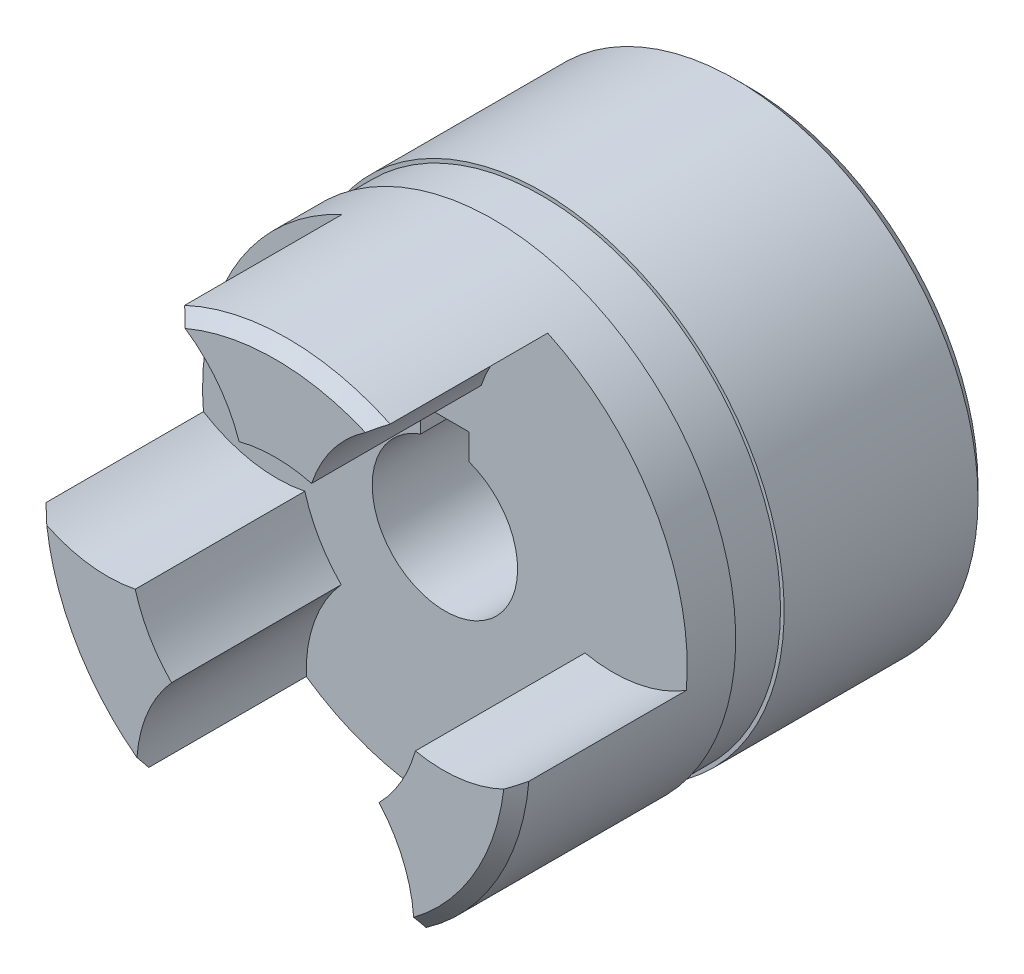
ISO-10303-21;
HEADER;
FILE_DESCRIPTION(('STEP AP214'),'2;1');
FILE_NAME('part.step','',(''),(''),'','','');
FILE_SCHEMA(('AUTOMOTIVE_DESIGN { 1 0 10303 214 1 1 1 1 }'));
ENDSEC;
DATA;
#1=APPLICATION_CONTEXT('core data for automotive mechanical design processes');
#2=APPLICATION_PROTOCOL_DEFINITION('international standard','automotive_design',2000,#1);
#3=PRODUCT_CONTEXT('',#1,'mechanical');
#4=PRODUCT('Part','Part','',(#3));
#5=PRODUCT_RELATED_PRODUCT_CATEGORY('part','',(#4));
#6=PRODUCT_DEFINITION_FORMATION('','',#4);
#7=PRODUCT_DEFINITION_CONTEXT('part definition',#1,'design');
#8=PRODUCT_DEFINITION('design','',#6,#7);
#9=PRODUCT_DEFINITION_SHAPE('','',#8);
#10=(LENGTH_UNIT() NAMED_UNIT(*) SI_UNIT(.MILLI.,.METRE.));
#11=(NAMED_UNIT(*) PLANE_ANGLE_UNIT() SI_UNIT($,.RADIAN.));
#12=(NAMED_UNIT(*) SI_UNIT($,.STERADIAN.) SOLID_ANGLE_UNIT());
#13=UNCERTAINTY_MEASURE_WITH_UNIT(LENGTH_MEASURE(1.E-05),#10,'distance_accuracy_value','');
#14=(GEOMETRIC_REPRESENTATION_CONTEXT(3) GLOBAL_UNCERTAINTY_ASSIGNED_CONTEXT((#13)) GLOBAL_UNIT_ASSIGNED_CONTEXT((#10,
#11,#12)) REPRESENTATION_CONTEXT('',''));
#15=CARTESIAN_POINT('',(0.,0.,0.));
#16=DIRECTION('',(0.,0.,1.));
#17=DIRECTION('',(1.,0.,0.));
#18=AXIS2_PLACEMENT_3D('',#15,#16,#17);
#19=CARTESIAN_POINT('',(0.,0.,-8.));
#20=DIRECTION('',(0.,0.,1.));
#21=DIRECTION('',(1.,0.,0.));
#22=AXIS2_PLACEMENT_3D('',#19,#20,#21);
#23=CYLINDRICAL_SURFACE('',#22,19.7);
#24=CARTESIAN_POINT('',(0.,0.,-8.));
#25=DIRECTION('',(0.,0.,1.));
#26=DIRECTION('',(1.,0.,0.));
#27=AXIS2_PLACEMENT_3D('',#24,#25,#26);
#28=CIRCLE('',#27,19.7);
#29=CARTESIAN_POINT('',(19.7,0.,-8.));
#30=VERTEX_POINT('',#29);
#31=EDGE_CURVE('E385',#30,#30,#28,.T.);
#32=ORIENTED_EDGE('',*,*,#31,.T.);
#33=EDGE_LOOP('',(#32));
#34=FACE_BOUND('',#33,.T.);
#35=CARTESIAN_POINT('',(0.,0.,-4.));
#36=DIRECTION('',(0.,0.,1.));
#37=DIRECTION('',(1.,0.,0.));
#38=AXIS2_PLACEMENT_3D('',#35,#36,#37);
#39=CIRCLE('',#38,19.7);
#40=CARTESIAN_POINT('',(19.7,0.,-4.));
#41=VERTEX_POINT('',#40);
#42=EDGE_CURVE('E178',#41,#41,#39,.F.);
#43=ORIENTED_EDGE('',*,*,#42,.T.);
#44=EDGE_LOOP('',(#43));
#45=FACE_BOUND('',#44,.T.);
#46=ADVANCED_FACE('F17',(#34,#45),#23,.T.);
#47=CARTESIAN_POINT('',(19.61485821221,19.68368593757,14.));
#48=DIRECTION('',(0.,0.,-1.));
#49=DIRECTION('',(0.,-1.,0.));
#50=AXIS2_PLACEMENT_3D('',#47,#48,#49);
#51=PLANE('',#50);
#52=CARTESIAN_POINT('',(13.85640646055,8.,14.));
#53=DIRECTION('',(0.,0.,-1.));
#54=DIRECTION('',(0.,1.,0.));
#55=AXIS2_PLACEMENT_3D('',#52,#53,#54);
#56=CIRCLE('',#55,11.4499999999984);
#57=CARTESIAN_POINT('',(18.8604405886663,-2.29864760270062,13.9999999999997));
#58=VERTEX_POINT('',#57);
#59=CARTESIAN_POINT('',(11.5606152329054,-3.21747967153116,14.));
#60=VERTEX_POINT('',#59);
#61=EDGE_CURVE('E384',#58,#60,#56,.T.);
#62=ORIENTED_EDGE('',*,*,#61,.T.);
#63=CARTESIAN_POINT('',(0.,0.,14.));
#64=DIRECTION('',(0.,0.,-1.));
#65=DIRECTION('',(-1.,0.,0.));
#66=AXIS2_PLACEMENT_3D('',#63,#64,#65);
#67=CIRCLE('',#66,12.);
#68=CARTESIAN_POINT('',(8.56672647835145,-8.40304683145196,14.));
#69=VERTEX_POINT('',#68);
#70=EDGE_CURVE('E509',#60,#69,#67,.T.);
#71=ORIENTED_EDGE('',*,*,#70,.T.);
#72=CARTESIAN_POINT('',(0.,-16.,14.));
#73=DIRECTION('',(0.,0.,-1.));
#74=DIRECTION('',(-1.,0.,0.));
#75=AXIS2_PLACEMENT_3D('',#72,#73,#74);
#76=CIRCLE('',#75,11.45);
#77=CARTESIAN_POINT('',(11.420907512622,-15.184296875,14.));
#78=VERTEX_POINT('',#77);
#79=EDGE_CURVE('E508',#69,#78,#76,.T.);
#80=ORIENTED_EDGE('',*,*,#79,.T.);
#81=CARTESIAN_POINT('',(0.,0.,14.));
#82=DIRECTION('',(0.,0.,-1.));
#83=DIRECTION('',(-1.,0.,0.));
#84=AXIS2_PLACEMENT_3D('',#81,#82,#83);
#85=CIRCLE('',#84,19.);
#86=EDGE_CURVE('E393',#78,#58,#85,.F.);
#87=ORIENTED_EDGE('',*,*,#86,.T.);
#88=EDGE_LOOP('',(#62,#71,#80,#87));
#89=FACE_BOUND('',#88,.T.);
#90=ADVANCED_FACE('F543',(#89),#51,.F.);
#91=CARTESIAN_POINT('',(19.61485821221,19.68368593757,14.));
#92=DIRECTION('',(0.,0.,-1.));
#93=DIRECTION('',(0.,-1.,0.));
#94=AXIS2_PLACEMENT_3D('',#91,#92,#93);
#95=PLANE('',#94);
#96=CARTESIAN_POINT('',(0.,-16.,14.));
#97=DIRECTION('',(0.,0.,-1.));
#98=DIRECTION('',(-1.,0.,0.));
#99=AXIS2_PLACEMENT_3D('',#96,#97,#98);
#100=CIRCLE('',#99,11.45);
#101=CARTESIAN_POINT('',(-11.420907512622,-15.1842968750002,13.9999999999998));
#102=VERTEX_POINT('',#101);
#103=CARTESIAN_POINT('',(-8.56672675743278,-8.40304662985308,14.));
#104=VERTEX_POINT('',#103);
#105=EDGE_CURVE('E171',#102,#104,#100,.T.);
#106=ORIENTED_EDGE('',*,*,#105,.T.);
#107=CARTESIAN_POINT('',(0.,0.,14.));
#108=DIRECTION('',(0.,0.,-1.));
#109=DIRECTION('',(-1.,0.,0.));
#110=AXIS2_PLACEMENT_3D('',#107,#108,#109);
#111=CIRCLE('',#110,12.);
#112=CARTESIAN_POINT('',(-11.5606152654855,-3.21747934201922,14.));
#113=VERTEX_POINT('',#112);
#114=EDGE_CURVE('E201',#104,#113,#111,.T.);
#115=ORIENTED_EDGE('',*,*,#114,.T.);
#116=CARTESIAN_POINT('',(-13.85640646055,8.,14.));
#117=DIRECTION('',(0.,0.,-1.));
#118=DIRECTION('',(0.,1.,0.));
#119=AXIS2_PLACEMENT_3D('',#116,#117,#118);
#120=CIRCLE('',#119,11.4499999999984);
#121=CARTESIAN_POINT('',(-18.8604405886668,-2.2986476027004,14.));
#122=VERTEX_POINT('',#121);
#123=EDGE_CURVE('E174',#113,#122,#120,.T.);
#124=ORIENTED_EDGE('',*,*,#123,.T.);
#125=CARTESIAN_POINT('',(0.,0.,14.));
#126=DIRECTION('',(0.,0.,-1.));
#127=DIRECTION('',(-1.,0.,0.));
#128=AXIS2_PLACEMENT_3D('',#125,#126,#127);
#129=CIRCLE('',#128,19.);
#130=EDGE_CURVE('E167',#122,#102,#129,.F.);
#131=ORIENTED_EDGE('',*,*,#130,.T.);
#132=EDGE_LOOP('',(#106,#115,#124,#131));
#133=FACE_BOUND('',#132,.T.);
#134=ADVANCED_FACE('F169',(#133),#95,.F.);
#135=CARTESIAN_POINT('',(0.,0.,14.0000000000006));
#136=DIRECTION('',(0.,0.,-1.));
#137=DIRECTION('',(-1.,0.,0.));
#138=AXIS2_PLACEMENT_3D('',#135,#136,#137);
#139=CONICAL_SURFACE('',#138,18.9999999999994,0.78539816339745);
#140=CARTESIAN_POINT('',(-11.4429040552017,-16.4030468750003,12.9999999999998));
#141=CARTESIAN_POINT('',(-11.4465184009376,-16.3004332788792,13.0820907045157));
#142=CARTESIAN_POINT('',(-11.4487430188522,-16.1980371683509,13.1645131805009));
#143=CARTESIAN_POINT('',(-11.4504535537168,-15.9937865384396,13.329959140045));
#144=CARTESIAN_POINT('',(-11.4499407306189,-15.8919317914905,13.4129823295464));
#145=CARTESIAN_POINT('',(-11.4462203954906,-15.6887763206067,13.5796424809558));
#146=CARTESIAN_POINT('',(-11.4430128933425,-15.5874755946418,13.6632794406118));
#147=CARTESIAN_POINT('',(-11.4339425988685,-15.3854375486664,13.8311827606449));
#148=CARTESIAN_POINT('',(-11.4280785846317,-15.2847005095442,13.9154493930896));
#149=CARTESIAN_POINT('',(-11.420907512622,-15.1842968750005,13.9999999999996));
#150=B_SPLINE_CURVE_WITH_KNOTS('',3,(#140,#141,#142,#143,#144,#145,#146,#147,#148,#149),
.UNSPECIFIED.,.F.,.F.,(4,2,2,2,4),(0.,0.394368242136269,0.788554985519403,1.18274028331963,
1.57710707819181),.UNSPECIFIED.);
#151=CARTESIAN_POINT('',(-11.4429040552012,-16.4030468750004,13.));
#152=VERTEX_POINT('',#151);
#153=EDGE_CURVE('E182',#152,#102,#150,.T.);
#154=ORIENTED_EDGE('',*,*,#153,.T.);
#155=ORIENTED_EDGE('',*,*,#130,.F.);
#156=CARTESIAN_POINT('',(-18.8604405886662,-2.29864760270069,13.9999999999998));
#157=CARTESIAN_POINT('',(-18.9509782228181,-2.25465611596156,13.9154493930899));
#158=CARTESIAN_POINT('',(-19.0411510649184,-2.20936598169772,13.8311827606452));
#159=CARTESIAN_POINT('',(-19.2206562925009,-2.11620206414432,13.6632794406122));
#160=CARTESIAN_POINT('',(-19.3099890456824,-2.06832947950483,13.5796424809562));
#161=CARTESIAN_POINT('',(-19.4877870119495,-1.9699736487946,13.4129823295469));
#162=CARTESIAN_POINT('',(-19.5762522218525,-1.91949039315051,13.3299591400454));
#163=CARTESIAN_POINT('',(-19.7522831886621,-1.81588371154803,13.1645131805015));
#164=CARTESIAN_POINT('',(-19.8398485126711,-1.76275908065621,13.0820907045163));
#165=CARTESIAN_POINT('',(-19.9269073208177,-1.7083221673703,13.0000000000004));
#166=B_SPLINE_CURVE_WITH_KNOTS('',3,(#156,#157,#158,#159,#160,#161,#162,#163,#164,#165),
.UNSPECIFIED.,.F.,.F.,(4,2,2,2,4),(0.,0.394366794872025,0.788552092672095,1.18273883605507,
1.57710707819117),.UNSPECIFIED.);
#167=CARTESIAN_POINT('',(-19.9269073208177,-1.70832216737156,13.0000000000002));
#168=VERTEX_POINT('',#167);
#169=EDGE_CURVE('E231',#122,#168,#166,.T.);
#170=ORIENTED_EDGE('',*,*,#169,.T.);
#171=CARTESIAN_POINT('',(0.,0.,13.));
#172=DIRECTION('',(0.,0.,-1.));
#173=DIRECTION('',(0.,-1.,0.));
#174=AXIS2_PLACEMENT_3D('',#171,#172,#173);
#175=CIRCLE('',#174,20.);
#176=EDGE_CURVE('E185',#168,#152,#175,.F.);
#177=ORIENTED_EDGE('',*,*,#176,.T.);
#178=EDGE_LOOP('',(#154,#155,#170,#177));
#179=FACE_BOUND('',#178,.T.);
#180=ADVANCED_FACE('F183',(#179),#139,.T.);
#181=CARTESIAN_POINT('',(19.61485821221,19.68368593757,14.));
#182=DIRECTION('',(0.,0.,-1.));
#183=DIRECTION('',(0.,-1.,0.));
#184=AXIS2_PLACEMENT_3D('',#181,#182,#183);
#185=PLANE('',#184);
#186=CARTESIAN_POINT('',(13.85640646055,8.,14.));
#187=DIRECTION('',(0.,0.,-1.));
#188=DIRECTION('',(0.,1.,0.));
#189=AXIS2_PLACEMENT_3D('',#186,#187,#188);
#190=CIRCLE('',#189,11.4499999999984);
#191=CARTESIAN_POINT('',(2.99388879063361,11.6205261869952,14.));
#192=VERTEX_POINT('',#191);
#193=CARTESIAN_POINT('',(7.43953307604425,17.4829444777024,13.9999999999999));
#194=VERTEX_POINT('',#193);
#195=EDGE_CURVE('E356',#192,#194,#190,.T.);
#196=ORIENTED_EDGE('',*,*,#195,.T.);
#197=CARTESIAN_POINT('',(0.,0.,13.9999999999998));
#198=DIRECTION('',(0.,0.,-1.));
#199=DIRECTION('',(-1.,0.,0.));
#200=AXIS2_PLACEMENT_3D('',#197,#198,#199);
#201=CIRCLE('',#200,19.0000000000002);
#202=CARTESIAN_POINT('',(-7.43953307604464,17.4829444777026,14.0000000000001));
#203=VERTEX_POINT('',#202);
#204=EDGE_CURVE('E390',#194,#203,#201,.F.);
#205=ORIENTED_EDGE('',*,*,#204,.T.);
#206=CARTESIAN_POINT('',(-13.85640646055,8.,14.));
#207=DIRECTION('',(0.,0.,-1.));
#208=DIRECTION('',(0.,1.,0.));
#209=AXIS2_PLACEMENT_3D('',#206,#207,#208);
#210=CIRCLE('',#209,11.4499999999984);
#211=CARTESIAN_POINT('',(-2.9938883898766,11.6205263352811,14.));
#212=VERTEX_POINT('',#211);
#213=EDGE_CURVE('E486',#203,#212,#210,.T.);
#214=ORIENTED_EDGE('',*,*,#213,.T.);
#215=CARTESIAN_POINT('',(0.,0.,14.));
#216=DIRECTION('',(0.,0.,-1.));
#217=DIRECTION('',(-1.,0.,0.));
#218=AXIS2_PLACEMENT_3D('',#215,#216,#217);
#219=CIRCLE('',#218,12.);
#220=EDGE_CURVE('E481',#212,#192,#219,.T.);
#221=ORIENTED_EDGE('',*,*,#220,.T.);
#222=EDGE_LOOP('',(#196,#205,#214,#221));
#223=FACE_BOUND('',#222,.T.);
#224=ADVANCED_FACE('F224',(#223),#185,.F.);
#225=CARTESIAN_POINT('',(20.8,-20.8,-4.));
#226=DIRECTION('',(0.,0.,1.));
#227=DIRECTION('',(0.,1.,0.));
#228=AXIS2_PLACEMENT_3D('',#225,#226,#227);
#229=PLANE('',#228);
#230=ORIENTED_EDGE('',*,*,#42,.F.);
#231=EDGE_LOOP('',(#230));
#232=FACE_BOUND('',#231,.T.);
#233=CARTESIAN_POINT('',(0.,0.,-4.));
#234=DIRECTION('',(0.,0.,-1.));
#235=DIRECTION('',(-1.,0.,0.));
#236=AXIS2_PLACEMENT_3D('',#233,#234,#235);
#237=CIRCLE('',#236,20.);
#238=CARTESIAN_POINT('',(-20.,0.,-4.));
#239=VERTEX_POINT('',#238);
#240=EDGE_CURVE('E343',#239,#239,#237,.T.);
#241=ORIENTED_EDGE('',*,*,#240,.T.);
#242=EDGE_LOOP('',(#241));
#243=FACE_BOUND('',#242,.T.);
#244=ADVANCED_FACE('F401',(#232,#243),#229,.F.);
#245=CARTESIAN_POINT('',(0.,0.,14.0000000000006));
#246=DIRECTION('',(0.,0.,-1.));
#247=DIRECTION('',(-1.,0.,0.));
#248=AXIS2_PLACEMENT_3D('',#245,#246,#247);
#249=CONICAL_SURFACE('',#248,18.9999999999994,0.78539816339745);
#250=CARTESIAN_POINT('',(19.9269073208177,-1.7083221673703,13.0000000000004));
#251=CARTESIAN_POINT('',(19.8398485126711,-1.76275908065618,13.0820907045163));
#252=CARTESIAN_POINT('',(19.7522831886622,-1.81588371154798,13.1645131805014));
#253=CARTESIAN_POINT('',(19.5762522218527,-1.91949039315041,13.3299591400453));
#254=CARTESIAN_POINT('',(19.4877870119497,-1.96997364879447,13.4129823295467));
#255=CARTESIAN_POINT('',(19.3099890456827,-2.06832947950465,13.5796424809559));
#256=CARTESIAN_POINT('',(19.2206562925013,-2.11620206414412,13.6632794406118));
#257=CARTESIAN_POINT('',(19.0411510649188,-2.20936598169749,13.8311827606448));
#258=CARTESIAN_POINT('',(18.9509782228186,-2.25465611596131,13.9154493930894));
#259=CARTESIAN_POINT('',(18.8604405886667,-2.29864760270042,13.9999999999993));
#260=B_SPLINE_CURVE_WITH_KNOTS('',3,(#250,#251,#252,#253,#254,#255,#256,#257,#258,#259),
.UNSPECIFIED.,.F.,.F.,(4,2,2,2,4),(0.,0.394368242135905,0.788554985518682,1.18274028331855,
1.57710707819037),.UNSPECIFIED.);
#261=CARTESIAN_POINT('',(19.9269073208179,-1.70832216737143,13.));
#262=VERTEX_POINT('',#261);
#263=EDGE_CURVE('E375',#262,#58,#260,.T.);
#264=ORIENTED_EDGE('',*,*,#263,.T.);
#265=ORIENTED_EDGE('',*,*,#86,.F.);
#266=CARTESIAN_POINT('',(11.420907512622,-15.1842968749999,14.));
#267=CARTESIAN_POINT('',(11.4280785846316,-15.2847005095437,13.91544939309));
#268=CARTESIAN_POINT('',(11.4339425988685,-15.385437548666,13.8311827606453));
#269=CARTESIAN_POINT('',(11.4430128933425,-15.5874755946415,13.6632794406121));
#270=CARTESIAN_POINT('',(11.4462203954906,-15.6887763206064,13.5796424809561));
#271=CARTESIAN_POINT('',(11.4499407306189,-15.8919317914902,13.4129823295466));
#272=CARTESIAN_POINT('',(11.4504535537169,-15.9937865384395,13.3299591400451));
#273=CARTESIAN_POINT('',(11.4487430188522,-16.1980371683508,13.164513180501));
#274=CARTESIAN_POINT('',(11.4465184009376,-16.3004332788791,13.0820907045158));
#275=CARTESIAN_POINT('',(11.4429040552017,-16.4030468750003,12.9999999999998));
#276=B_SPLINE_CURVE_WITH_KNOTS('',3,(#266,#267,#268,#269,#270,#271,#272,#273,#274,#275),
.UNSPECIFIED.,.F.,.F.,(4,2,2,2,4),(0.,0.394366794872353,0.788552092672748,1.18273883605605,
1.57710707819248),.UNSPECIFIED.);
#277=CARTESIAN_POINT('',(11.4429040552012,-16.4030468750005,13.));
#278=VERTEX_POINT('',#277);
#279=EDGE_CURVE('E189',#78,#278,#276,.T.);
#280=ORIENTED_EDGE('',*,*,#279,.T.);
#281=CARTESIAN_POINT('',(0.,0.,13.));
#282=DIRECTION('',(0.,0.,-1.));
#283=DIRECTION('',(0.,-1.,0.));
#284=AXIS2_PLACEMENT_3D('',#281,#282,#283);
#285=CIRCLE('',#284,20.);
#286=EDGE_CURVE('E475',#278,#262,#285,.F.);
#287=ORIENTED_EDGE('',*,*,#286,.T.);
#288=EDGE_LOOP('',(#264,#265,#280,#287));
#289=FACE_BOUND('',#288,.T.);
#290=ADVANCED_FACE('F225',(#289),#249,.T.);
#291=CARTESIAN_POINT('',(0.,0.,14.0000000000014));
#292=DIRECTION('',(0.,0.,-1.));
#293=DIRECTION('',(-1.,0.,0.));
#294=AXIS2_PLACEMENT_3D('',#291,#292,#293);
#295=CONICAL_SURFACE('',#294,18.9999999999986,0.785398163397453);
#296=CARTESIAN_POINT('',(7.43953307604418,17.4829444777023,14.0000000000006));
#297=CARTESIAN_POINT('',(7.52289963818652,17.5393566255069,13.9154493930906));
#298=CARTESIAN_POINT('',(7.60720846605,17.5948035303653,13.8311827606459));
#299=CARTESIAN_POINT('',(7.7776433991587,17.7036776587873,13.6632794406128));
#300=CARTESIAN_POINT('',(7.86376865019208,17.7571058001127,13.5796424809568));
#301=CARTESIAN_POINT('',(8.03784628133111,17.8619054402862,13.4129823295473));
#302=CARTESIAN_POINT('',(8.12579866813616,17.9132769315913,13.3299591400458));
#303=CARTESIAN_POINT('',(8.30354016981064,18.0139208799001,13.1645131805017));
#304=CARTESIAN_POINT('',(8.39333011173415,18.0631923595366,13.0820907045166));
#305=CARTESIAN_POINT('',(8.4840032656167,18.1113690423717,13.0000000000006));
#306=B_SPLINE_CURVE_WITH_KNOTS('',3,(#296,#297,#298,#299,#300,#301,#302,#303,#304,#305),
.UNSPECIFIED.,.F.,.F.,(4,2,2,2,4),(0.,0.394366794872261,0.78855209267256,1.18273883605576,
1.5771070781921),.UNSPECIFIED.);
#307=CARTESIAN_POINT('',(8.48400326561687,18.111369042372,13.0000000000003));
#308=VERTEX_POINT('',#307);
#309=EDGE_CURVE('E348',#194,#308,#306,.T.);
#310=ORIENTED_EDGE('',*,*,#309,.T.);
#311=CARTESIAN_POINT('',(0.,0.,13.));
#312=DIRECTION('',(0.,0.,-1.));
#313=DIRECTION('',(0.,-1.,0.));
#314=AXIS2_PLACEMENT_3D('',#311,#312,#313);
#315=CIRCLE('',#314,20.);
#316=CARTESIAN_POINT('',(-8.48400326561638,18.1113690423716,13.0000000000009));
#317=VERTEX_POINT('',#316);
#318=EDGE_CURVE('E342',#308,#317,#315,.F.);
#319=ORIENTED_EDGE('',*,*,#318,.T.);
#320=CARTESIAN_POINT('',(-8.48400326561643,18.1113690423716,13.0000000000008));
#321=CARTESIAN_POINT('',(-8.39333011173392,18.0631923595364,13.0820907045168));
#322=CARTESIAN_POINT('',(-8.30354016981044,18.0139208799,13.1645131805019));
#323=CARTESIAN_POINT('',(-8.12579866813602,17.9132769315913,13.329959140046));
#324=CARTESIAN_POINT('',(-8.037846281331,17.8619054402862,13.4129823295474));
#325=CARTESIAN_POINT('',(-7.86376865019203,17.7571058001127,13.5796424809568));
#326=CARTESIAN_POINT('',(-7.77764339915867,17.7036776587873,13.6632794406128));
#327=CARTESIAN_POINT('',(-7.60720846605003,17.5948035303653,13.8311827606459));
#328=CARTESIAN_POINT('',(-7.52289963818658,17.5393566255069,13.9154493930905));
#329=CARTESIAN_POINT('',(-7.43953307604427,17.4829444777024,14.0000000000005));
#330=B_SPLINE_CURVE_WITH_KNOTS('',3,(#320,#321,#322,#323,#324,#325,#326,#327,#328,#329),
.UNSPECIFIED.,.F.,.F.,(4,2,2,2,4),(0.,0.394368242136215,0.788554985519295,1.18274028331947,
1.5771070781916),.UNSPECIFIED.);
#331=EDGE_CURVE('E240',#317,#203,#330,.T.);
#332=ORIENTED_EDGE('',*,*,#331,.T.);
#333=ORIENTED_EDGE('',*,*,#204,.F.);
#334=EDGE_LOOP('',(#310,#319,#332,#333));
#335=FACE_BOUND('',#334,.T.);
#336=ADVANCED_FACE('F361',(#335),#295,.T.);
#337=CARTESIAN_POINT('',(20.8,-20.8,-8.));
#338=DIRECTION('',(0.,0.,1.));
#339=DIRECTION('',(0.,1.,0.));
#340=AXIS2_PLACEMENT_3D('',#337,#338,#339);
#341=PLANE('',#340);
#342=ORIENTED_EDGE('',*,*,#31,.F.);
#343=EDGE_LOOP('',(#342));
#344=FACE_BOUND('',#343,.T.);
#345=CARTESIAN_POINT('',(0.,0.,-8.));
#346=DIRECTION('',(0.,0.,-1.));
#347=DIRECTION('',(-1.,0.,0.));
#348=AXIS2_PLACEMENT_3D('',#345,#346,#347);
#349=CIRCLE('',#348,20.);
#350=CARTESIAN_POINT('',(-20.,0.,-8.));
#351=VERTEX_POINT('',#350);
#352=EDGE_CURVE('E338',#351,#351,#349,.F.);
#353=ORIENTED_EDGE('',*,*,#352,.T.);
#354=EDGE_LOOP('',(#353));
#355=FACE_BOUND('',#354,.T.);
#356=ADVANCED_FACE('F365',(#344,#355),#341,.T.);
#357=CARTESIAN_POINT('',(13.85640646055,8.,14.));
#358=DIRECTION('',(0.,0.,-1.));
#359=DIRECTION('',(0.,1.,0.));
#360=AXIS2_PLACEMENT_3D('',#357,#358,#359);
#361=CYLINDRICAL_SURFACE('',#360,11.4499999999984);
#362=ORIENTED_EDGE('',*,*,#263,.F.);
#363=DIRECTION('',(0.,0.,-1.));
#364=VECTOR('',#363,1.);
#365=CARTESIAN_POINT('',(19.9269073208178,-1.70832216737282,-5.5));
#366=LINE('',#365,#364);
#367=CARTESIAN_POINT('',(19.9269073208179,-1.70832216737143,0.));
#368=VERTEX_POINT('',#367);
#369=EDGE_CURVE('E471',#262,#368,#366,.T.);
#370=ORIENTED_EDGE('',*,*,#369,.T.);
#371=CARTESIAN_POINT('',(13.85640646055,8.,0.));
#372=DIRECTION('',(0.,0.,-1.));
#373=DIRECTION('',(0.,1.,0.));
#374=AXIS2_PLACEMENT_3D('',#371,#372,#373);
#375=CIRCLE('',#374,11.4499999999984);
#376=CARTESIAN_POINT('',(11.5606152329054,-3.21747967153116,0.));
#377=VERTEX_POINT('',#376);
#378=EDGE_CURVE('E335',#368,#377,#375,.T.);
#379=ORIENTED_EDGE('',*,*,#378,.T.);
#380=DIRECTION('',(0.,0.,-1.));
#381=VECTOR('',#380,1.);
#382=CARTESIAN_POINT('',(11.560615144384,-3.21747998959408,7.));
#383=LINE('',#382,#381);
#384=EDGE_CURVE('E510',#377,#60,#383,.F.);
#385=ORIENTED_EDGE('',*,*,#384,.T.);
#386=ORIENTED_EDGE('',*,*,#61,.F.);
#387=EDGE_LOOP('',(#362,#370,#379,#385,#386));
#388=FACE_BOUND('',#387,.T.);
#389=ADVANCED_FACE('F367',(#388),#361,.F.);
#390=CARTESIAN_POINT('',(0.,0.,14.));
#391=DIRECTION('',(0.,0.,-1.));
#392=DIRECTION('',(-1.,0.,0.));
#393=AXIS2_PLACEMENT_3D('',#390,#391,#392);
#394=CYLINDRICAL_SURFACE('',#393,12.);
#395=ORIENTED_EDGE('',*,*,#384,.F.);
#396=CARTESIAN_POINT('',(0.,0.,0.));
#397=DIRECTION('',(0.,0.,-1.));
#398=DIRECTION('',(-1.,0.,0.));
#399=AXIS2_PLACEMENT_3D('',#396,#397,#398);
#400=CIRCLE('',#399,12.);
#401=CARTESIAN_POINT('',(8.56672647835145,-8.40304683145196,0.));
#402=VERTEX_POINT('',#401);
#403=EDGE_CURVE('E332',#377,#402,#400,.T.);
#404=ORIENTED_EDGE('',*,*,#403,.T.);
#405=DIRECTION('',(0.,0.,-1.));
#406=VECTOR('',#405,1.);
#407=CARTESIAN_POINT('',(8.56672643973315,-8.40304678790391,7.));
#408=LINE('',#407,#406);
#409=EDGE_CURVE('E504',#402,#69,#408,.F.);
#410=ORIENTED_EDGE('',*,*,#409,.T.);
#411=ORIENTED_EDGE('',*,*,#70,.F.);
#412=EDGE_LOOP('',(#395,#404,#410,#411));
#413=FACE_BOUND('',#412,.T.);
#414=ADVANCED_FACE('F372',(#413),#394,.F.);
#415=CARTESIAN_POINT('',(0.,-16.,14.));
#416=DIRECTION('',(0.,0.,-1.));
#417=DIRECTION('',(-1.,0.,0.));
#418=AXIS2_PLACEMENT_3D('',#415,#416,#417);
#419=CYLINDRICAL_SURFACE('',#418,11.45);
#420=DIRECTION('',(0.,0.,1.));
#421=VECTOR('',#420,1.);
#422=CARTESIAN_POINT('',(11.4429040552006,-16.4030468750008,-5.5));
#423=LINE('',#422,#421);
#424=CARTESIAN_POINT('',(11.4429040552012,-16.4030468750004,0.));
#425=VERTEX_POINT('',#424);
#426=EDGE_CURVE('E347',#425,#278,#423,.T.);
#427=ORIENTED_EDGE('',*,*,#426,.T.);
#428=ORIENTED_EDGE('',*,*,#279,.F.);
#429=ORIENTED_EDGE('',*,*,#79,.F.);
#430=ORIENTED_EDGE('',*,*,#409,.F.);
#431=CARTESIAN_POINT('',(0.,-16.,0.));
#432=DIRECTION('',(0.,0.,-1.));
#433=DIRECTION('',(-1.,0.,0.));
#434=AXIS2_PLACEMENT_3D('',#431,#432,#433);
#435=CIRCLE('',#434,11.45);
#436=EDGE_CURVE('E328',#402,#425,#435,.T.);
#437=ORIENTED_EDGE('',*,*,#436,.T.);
#438=EDGE_LOOP('',(#427,#428,#429,#430,#437));
#439=FACE_BOUND('',#438,.T.);
#440=ADVANCED_FACE('F263',(#439),#419,.F.);
#441=CARTESIAN_POINT('',(0.,-16.,14.));
#442=DIRECTION('',(0.,0.,-1.));
#443=DIRECTION('',(-1.,0.,0.));
#444=AXIS2_PLACEMENT_3D('',#441,#442,#443);
#445=CYLINDRICAL_SURFACE('',#444,11.45);
#446=ORIENTED_EDGE('',*,*,#153,.F.);
#447=DIRECTION('',(0.,0.,-1.));
#448=VECTOR('',#447,1.);
#449=CARTESIAN_POINT('',(-11.4429040552006,-16.4030468750008,-5.5));
#450=LINE('',#449,#448);
#451=CARTESIAN_POINT('',(-11.4429040552012,-16.4030468750004,0.));
#452=VERTEX_POINT('',#451);
#453=EDGE_CURVE('E491',#152,#452,#450,.T.);
#454=ORIENTED_EDGE('',*,*,#453,.T.);
#455=CARTESIAN_POINT('',(0.,-16.,0.));
#456=DIRECTION('',(0.,0.,-1.));
#457=DIRECTION('',(-1.,0.,0.));
#458=AXIS2_PLACEMENT_3D('',#455,#456,#457);
#459=CIRCLE('',#458,11.45);
#460=CARTESIAN_POINT('',(-8.56672675743278,-8.40304662985308,0.));
#461=VERTEX_POINT('',#460);
#462=EDGE_CURVE('E321',#452,#461,#459,.T.);
#463=ORIENTED_EDGE('',*,*,#462,.T.);
#464=DIRECTION('',(0.,0.,-1.));
#465=VECTOR('',#464,1.);
#466=CARTESIAN_POINT('',(-8.5667269978958,-8.40304638470616,7.));
#467=LINE('',#466,#465);
#468=EDGE_CURVE('E193',#461,#104,#467,.F.);
#469=ORIENTED_EDGE('',*,*,#468,.T.);
#470=ORIENTED_EDGE('',*,*,#105,.F.);
#471=EDGE_LOOP('',(#446,#454,#463,#469,#470));
#472=FACE_BOUND('',#471,.T.);
#473=ADVANCED_FACE('F191',(#472),#445,.F.);
#474=CARTESIAN_POINT('',(0.,0.,14.));
#475=DIRECTION('',(0.,0.,-1.));
#476=DIRECTION('',(-1.,0.,0.));
#477=AXIS2_PLACEMENT_3D('',#474,#475,#476);
#478=CYLINDRICAL_SURFACE('',#477,12.);
#479=ORIENTED_EDGE('',*,*,#468,.F.);
#480=CARTESIAN_POINT('',(0.,0.,0.));
#481=DIRECTION('',(0.,0.,-1.));
#482=DIRECTION('',(-1.,0.,0.));
#483=AXIS2_PLACEMENT_3D('',#480,#481,#482);
#484=CIRCLE('',#483,12.);
#485=CARTESIAN_POINT('',(-11.5606152654855,-3.21747934201922,0.));
#486=VERTEX_POINT('',#485);
#487=EDGE_CURVE('E318',#461,#486,#484,.T.);
#488=ORIENTED_EDGE('',*,*,#487,.T.);
#489=DIRECTION('',(0.,0.,-1.));
#490=VECTOR('',#489,1.);
#491=CARTESIAN_POINT('',(-11.5606152095442,-3.21747933057017,7.));
#492=LINE('',#491,#490);
#493=EDGE_CURVE('E495',#486,#113,#492,.F.);
#494=ORIENTED_EDGE('',*,*,#493,.T.);
#495=ORIENTED_EDGE('',*,*,#114,.F.);
#496=EDGE_LOOP('',(#479,#488,#494,#495));
#497=FACE_BOUND('',#496,.T.);
#498=ADVANCED_FACE('F251',(#497),#478,.F.);
#499=CARTESIAN_POINT('',(-13.85640646055,8.,14.));
#500=DIRECTION('',(0.,0.,-1.));
#501=DIRECTION('',(0.,1.,0.));
#502=AXIS2_PLACEMENT_3D('',#499,#500,#501);
#503=CYLINDRICAL_SURFACE('',#502,11.4499999999984);
#504=DIRECTION('',(0.,0.,1.));
#505=VECTOR('',#504,1.);
#506=CARTESIAN_POINT('',(-19.9269073208178,-1.70832216737282,-5.5));
#507=LINE('',#506,#505);
#508=CARTESIAN_POINT('',(-19.9269073208179,-1.70832216737143,0.));
#509=VERTEX_POINT('',#508);
#510=EDGE_CURVE('E239',#509,#168,#507,.T.);
#511=ORIENTED_EDGE('',*,*,#510,.T.);
#512=ORIENTED_EDGE('',*,*,#169,.F.);
#513=ORIENTED_EDGE('',*,*,#123,.F.);
#514=ORIENTED_EDGE('',*,*,#493,.F.);
#515=CARTESIAN_POINT('',(-13.85640646055,8.,0.));
#516=DIRECTION('',(0.,0.,-1.));
#517=DIRECTION('',(0.,1.,0.));
#518=AXIS2_PLACEMENT_3D('',#515,#516,#517);
#519=CIRCLE('',#518,11.4499999999984);
#520=EDGE_CURVE('E315',#486,#509,#519,.T.);
#521=ORIENTED_EDGE('',*,*,#520,.T.);
#522=EDGE_LOOP('',(#511,#512,#513,#514,#521));
#523=FACE_BOUND('',#522,.T.);
#524=ADVANCED_FACE('F247',(#523),#503,.F.);
#525=CARTESIAN_POINT('',(-13.85640646055,8.,14.));
#526=DIRECTION('',(0.,0.,-1.));
#527=DIRECTION('',(0.,1.,0.));
#528=AXIS2_PLACEMENT_3D('',#525,#526,#527);
#529=CYLINDRICAL_SURFACE('',#528,11.4499999999984);
#530=ORIENTED_EDGE('',*,*,#331,.F.);
#531=DIRECTION('',(0.,0.,-1.));
#532=VECTOR('',#531,1.);
#533=CARTESIAN_POINT('',(-8.48400326561542,18.1113690423711,7.));
#534=LINE('',#533,#532);
#535=CARTESIAN_POINT('',(-8.48400326561638,18.1113690423716,0.));
#536=VERTEX_POINT('',#535);
#537=EDGE_CURVE('E487',#536,#317,#534,.F.);
#538=ORIENTED_EDGE('',*,*,#537,.F.);
#539=CARTESIAN_POINT('',(-13.85640646055,8.,0.));
#540=DIRECTION('',(0.,0.,-1.));
#541=DIRECTION('',(0.,1.,0.));
#542=AXIS2_PLACEMENT_3D('',#539,#540,#541);
#543=CIRCLE('',#542,11.4499999999984);
#544=CARTESIAN_POINT('',(-2.9938883898766,11.6205263352811,0.));
#545=VERTEX_POINT('',#544);
#546=EDGE_CURVE('E309',#536,#545,#543,.T.);
#547=ORIENTED_EDGE('',*,*,#546,.T.);
#548=DIRECTION('',(0.,0.,-1.));
#549=VECTOR('',#548,1.);
#550=CARTESIAN_POINT('',(-2.99388797529603,11.6205264420928,7.));
#551=LINE('',#550,#549);
#552=EDGE_CURVE('E482',#545,#212,#551,.F.);
#553=ORIENTED_EDGE('',*,*,#552,.T.);
#554=ORIENTED_EDGE('',*,*,#213,.F.);
#555=EDGE_LOOP('',(#530,#538,#547,#553,#554));
#556=FACE_BOUND('',#555,.T.);
#557=ADVANCED_FACE('F250',(#556),#529,.F.);
#558=CARTESIAN_POINT('',(0.,0.,14.));
#559=DIRECTION('',(0.,0.,-1.));
#560=DIRECTION('',(-1.,0.,0.));
#561=AXIS2_PLACEMENT_3D('',#558,#559,#560);
#562=CYLINDRICAL_SURFACE('',#561,12.);
#563=ORIENTED_EDGE('',*,*,#552,.F.);
#564=CARTESIAN_POINT('',(0.,0.,0.));
#565=DIRECTION('',(0.,0.,-1.));
#566=DIRECTION('',(-1.,0.,0.));
#567=AXIS2_PLACEMENT_3D('',#564,#565,#566);
#568=CIRCLE('',#567,12.);
#569=CARTESIAN_POINT('',(2.9938887906336,11.6205261869952,0.));
#570=VERTEX_POINT('',#569);
#571=EDGE_CURVE('E306',#545,#570,#568,.T.);
#572=ORIENTED_EDGE('',*,*,#571,.T.);
#573=DIRECTION('',(0.,0.,-1.));
#574=VECTOR('',#573,1.);
#575=CARTESIAN_POINT('',(2.99388877681005,11.6205261455209,7.));
#576=LINE('',#575,#574);
#577=EDGE_CURVE('E478',#570,#192,#576,.F.);
#578=ORIENTED_EDGE('',*,*,#577,.T.);
#579=ORIENTED_EDGE('',*,*,#220,.F.);
#580=EDGE_LOOP('',(#563,#572,#578,#579));
#581=FACE_BOUND('',#580,.T.);
#582=ADVANCED_FACE('F418',(#581),#562,.F.);
#583=CARTESIAN_POINT('',(13.85640646055,8.,14.));
#584=DIRECTION('',(0.,0.,-1.));
#585=DIRECTION('',(0.,1.,0.));
#586=AXIS2_PLACEMENT_3D('',#583,#584,#585);
#587=CYLINDRICAL_SURFACE('',#586,11.4499999999984);
#588=DIRECTION('',(0.,0.,1.));
#589=VECTOR('',#588,1.);
#590=CARTESIAN_POINT('',(8.48400326561704,18.1113690423722,-5.5));
#591=LINE('',#590,#589);
#592=CARTESIAN_POINT('',(8.48400326561719,18.1113690423722,0.));
#593=VERTEX_POINT('',#592);
#594=EDGE_CURVE('E474',#593,#308,#591,.T.);
#595=ORIENTED_EDGE('',*,*,#594,.T.);
#596=ORIENTED_EDGE('',*,*,#309,.F.);
#597=ORIENTED_EDGE('',*,*,#195,.F.);
#598=ORIENTED_EDGE('',*,*,#577,.F.);
#599=CARTESIAN_POINT('',(13.85640646055,8.,0.));
#600=DIRECTION('',(0.,0.,-1.));
#601=DIRECTION('',(0.,1.,0.));
#602=AXIS2_PLACEMENT_3D('',#599,#600,#601);
#603=CIRCLE('',#602,11.4499999999984);
#604=EDGE_CURVE('E49',#570,#593,#603,.T.);
#605=ORIENTED_EDGE('',*,*,#604,.T.);
#606=EDGE_LOOP('',(#595,#596,#597,#598,#605));
#607=FACE_BOUND('',#606,.T.);
#608=ADVANCED_FACE('F358',(#607),#587,.F.);
#609=CARTESIAN_POINT('',(0.,0.,13.));
#610=DIRECTION('',(0.,0.,-1.));
#611=DIRECTION('',(-1.,0.,0.));
#612=AXIS2_PLACEMENT_3D('',#609,#610,#611);
#613=CYLINDRICAL_SURFACE('',#612,20.);
#614=ORIENTED_EDGE('',*,*,#426,.F.);
#615=CARTESIAN_POINT('',(0.,0.,0.));
#616=DIRECTION('',(0.,0.,-1.));
#617=DIRECTION('',(-1.,0.,0.));
#618=AXIS2_PLACEMENT_3D('',#615,#616,#617);
#619=CIRCLE('',#618,20.);
#620=EDGE_CURVE('E324',#425,#452,#619,.T.);
#621=ORIENTED_EDGE('',*,*,#620,.T.);
#622=ORIENTED_EDGE('',*,*,#453,.F.);
#623=ORIENTED_EDGE('',*,*,#176,.F.);
#624=ORIENTED_EDGE('',*,*,#510,.F.);
#625=CARTESIAN_POINT('',(0.,0.,0.));
#626=DIRECTION('',(0.,0.,-1.));
#627=DIRECTION('',(-1.,0.,0.));
#628=AXIS2_PLACEMENT_3D('',#625,#626,#627);
#629=CIRCLE('',#628,20.);
#630=EDGE_CURVE('E312',#509,#536,#629,.T.);
#631=ORIENTED_EDGE('',*,*,#630,.T.);
#632=ORIENTED_EDGE('',*,*,#537,.T.);
#633=ORIENTED_EDGE('',*,*,#318,.F.);
#634=ORIENTED_EDGE('',*,*,#594,.F.);
#635=CARTESIAN_POINT('',(0.,0.,0.));
#636=DIRECTION('',(0.,0.,-1.));
#637=DIRECTION('',(-1.,0.,0.));
#638=AXIS2_PLACEMENT_3D('',#635,#636,#637);
#639=CIRCLE('',#638,20.);
#640=EDGE_CURVE('E296',#593,#368,#639,.T.);
#641=ORIENTED_EDGE('',*,*,#640,.T.);
#642=ORIENTED_EDGE('',*,*,#369,.F.);
#643=ORIENTED_EDGE('',*,*,#286,.F.);
#644=EDGE_LOOP('',(#614,#621,#622,#623,#624,#631,#632,#633,#634,#641,#642,#643));
#645=FACE_BOUND('',#644,.T.);
#646=ORIENTED_EDGE('',*,*,#240,.F.);
#647=EDGE_LOOP('',(#646));
#648=FACE_BOUND('',#647,.T.);
#649=ADVANCED_FACE('F407',(#645,#648),#613,.T.);
#650=CARTESIAN_POINT('',(0.,0.,-8.));
#651=DIRECTION('',(0.,0.,-1.));
#652=DIRECTION('',(-1.,0.,0.));
#653=AXIS2_PLACEMENT_3D('',#650,#651,#652);
#654=CYLINDRICAL_SURFACE('',#653,20.);
#655=CARTESIAN_POINT('',(0.,0.,-24.));
#656=DIRECTION('',(0.,0.,-1.));
#657=DIRECTION('',(0.,-1.,0.));
#658=AXIS2_PLACEMENT_3D('',#655,#656,#657);
#659=CIRCLE('',#658,20.);
#660=CARTESIAN_POINT('',(0.,-20.,-24.));
#661=VERTEX_POINT('',#660);
#662=EDGE_CURVE('E291',#661,#661,#659,.F.);
#663=ORIENTED_EDGE('',*,*,#662,.T.);
#664=EDGE_LOOP('',(#663));
#665=FACE_BOUND('',#664,.T.);
#666=ORIENTED_EDGE('',*,*,#352,.F.);
#667=EDGE_LOOP('',(#666));
#668=FACE_BOUND('',#667,.T.);
#669=ADVANCED_FACE('F409',(#665,#668),#654,.T.);
#670=CARTESIAN_POINT('',(20.80761987503,18.87359642322,0.));
#671=DIRECTION('',(0.,0.,-1.));
#672=DIRECTION('',(0.,-1.,0.));
#673=AXIS2_PLACEMENT_3D('',#670,#671,#672);
#674=PLANE('',#673);
#675=CARTESIAN_POINT('',(0.,0.,0.));
#676=DIRECTION('',(0.,0.,-1.));
#677=DIRECTION('',(-1.,0.,0.));
#678=AXIS2_PLACEMENT_3D('',#675,#676,#677);
#679=CIRCLE('',#678,6.);
#680=CARTESIAN_POINT('',(-2.,5.65685424949238,0.));
#681=VERTEX_POINT('',#680);
#682=CARTESIAN_POINT('',(2.,5.65685424949238,0.));
#683=VERTEX_POINT('',#682);
#684=EDGE_CURVE('E179',#681,#683,#679,.F.);
#685=ORIENTED_EDGE('',*,*,#684,.F.);
#686=DIRECTION('',(0.,-1.,0.));
#687=VECTOR('',#686,1.);
#688=CARTESIAN_POINT('',(-2.,4.2,0.));
#689=LINE('',#688,#687);
#690=CARTESIAN_POINT('',(-2.,7.8,0.));
#691=VERTEX_POINT('',#690);
#692=EDGE_CURVE('E447',#691,#681,#689,.T.);
#693=ORIENTED_EDGE('',*,*,#692,.F.);
#694=DIRECTION('',(-1.,0.,0.));
#695=VECTOR('',#694,1.);
#696=CARTESIAN_POINT('',(2.,7.8,0.));
#697=LINE('',#696,#695);
#698=CARTESIAN_POINT('',(2.,7.8,0.));
#699=VERTEX_POINT('',#698);
#700=EDGE_CURVE('E451',#699,#691,#697,.T.);
#701=ORIENTED_EDGE('',*,*,#700,.F.);
#702=DIRECTION('',(0.,1.,0.));
#703=VECTOR('',#702,1.);
#704=CARTESIAN_POINT('',(2.,4.2,0.));
#705=LINE('',#704,#703);
#706=EDGE_CURVE('E434',#683,#699,#705,.T.);
#707=ORIENTED_EDGE('',*,*,#706,.F.);
#708=EDGE_LOOP('',(#685,#693,#701,#707));
#709=FACE_BOUND('',#708,.T.);
#710=ORIENTED_EDGE('',*,*,#604,.F.);
#711=ORIENTED_EDGE('',*,*,#571,.F.);
#712=ORIENTED_EDGE('',*,*,#546,.F.);
#713=ORIENTED_EDGE('',*,*,#630,.F.);
#714=ORIENTED_EDGE('',*,*,#520,.F.);
#715=ORIENTED_EDGE('',*,*,#487,.F.);
#716=ORIENTED_EDGE('',*,*,#462,.F.);
#717=ORIENTED_EDGE('',*,*,#620,.F.);
#718=ORIENTED_EDGE('',*,*,#436,.F.);
#719=ORIENTED_EDGE('',*,*,#403,.F.);
#720=ORIENTED_EDGE('',*,*,#378,.F.);
#721=ORIENTED_EDGE('',*,*,#640,.F.);
#722=EDGE_LOOP('',(#710,#711,#712,#713,#714,#715,#716,#717,#718,#719,#720,#721));
#723=FACE_BOUND('',#722,.T.);
#724=ADVANCED_FACE('F277',(#709,#723),#674,.F.);
#725=CARTESIAN_POINT('',(0.,0.,-24.));
#726=DIRECTION('',(0.,0.,1.));
#727=DIRECTION('',(1.,0.,0.));
#728=AXIS2_PLACEMENT_3D('',#725,#726,#727);
#729=CONICAL_SURFACE('',#728,20.,0.785398163397448);
#730=CARTESIAN_POINT('',(0.,0.,-25.));
#731=DIRECTION('',(0.,0.,1.));
#732=DIRECTION('',(1.,0.,0.));
#733=AXIS2_PLACEMENT_3D('',#730,#731,#732);
#734=CIRCLE('',#733,19.);
#735=CARTESIAN_POINT('',(19.,0.,-25.));
#736=VERTEX_POINT('',#735);
#737=EDGE_CURVE('E289',#736,#736,#734,.T.);
#738=ORIENTED_EDGE('',*,*,#737,.T.);
#739=EDGE_LOOP('',(#738));
#740=FACE_BOUND('',#739,.T.);
#741=ORIENTED_EDGE('',*,*,#662,.F.);
#742=EDGE_LOOP('',(#741));
#743=FACE_BOUND('',#742,.T.);
#744=ADVANCED_FACE('F266',(#740,#743),#729,.T.);
#745=CARTESIAN_POINT('',(19.76,19.76,-25.));
#746=DIRECTION('',(0.,0.,-1.));
#747=DIRECTION('',(0.,-1.,0.));
#748=AXIS2_PLACEMENT_3D('',#745,#746,#747);
#749=PLANE('',#748);
#750=DIRECTION('',(0.,1.,0.));
#751=VECTOR('',#750,1.);
#752=CARTESIAN_POINT('',(-2.,4.2,-25.));
#753=LINE('',#752,#751);
#754=CARTESIAN_POINT('',(-2.,5.65685424949238,-25.));
#755=VERTEX_POINT('',#754);
#756=CARTESIAN_POINT('',(-2.,7.8,-25.));
#757=VERTEX_POINT('',#756);
#758=EDGE_CURVE('E285',#755,#757,#753,.T.);
#759=ORIENTED_EDGE('',*,*,#758,.F.);
#760=CARTESIAN_POINT('',(0.,0.,-25.));
#761=DIRECTION('',(0.,0.,-1.));
#762=DIRECTION('',(-1.,0.,0.));
#763=AXIS2_PLACEMENT_3D('',#760,#761,#762);
#764=CIRCLE('',#763,6.);
#765=CARTESIAN_POINT('',(2.,5.65685424949238,-25.));
#766=VERTEX_POINT('',#765);
#767=EDGE_CURVE('E461',#766,#755,#764,.T.);
#768=ORIENTED_EDGE('',*,*,#767,.F.);
#769=DIRECTION('',(0.,-1.,0.));
#770=VECTOR('',#769,1.);
#771=CARTESIAN_POINT('',(2.,4.2,-25.));
#772=LINE('',#771,#770);
#773=CARTESIAN_POINT('',(2.,7.8,-25.));
#774=VERTEX_POINT('',#773);
#775=EDGE_CURVE('E37',#774,#766,#772,.T.);
#776=ORIENTED_EDGE('',*,*,#775,.F.);
#777=DIRECTION('',(1.,0.,0.));
#778=VECTOR('',#777,1.);
#779=CARTESIAN_POINT('',(2.,7.8,-25.));
#780=LINE('',#779,#778);
#781=EDGE_CURVE('E453',#757,#774,#780,.T.);
#782=ORIENTED_EDGE('',*,*,#781,.F.);
#783=EDGE_LOOP('',(#759,#768,#776,#782));
#784=FACE_BOUND('',#783,.T.);
#785=ORIENTED_EDGE('',*,*,#737,.F.);
#786=EDGE_LOOP('',(#785));
#787=FACE_BOUND('',#786,.T.);
#788=ADVANCED_FACE('F19',(#784,#787),#749,.T.);
#789=CARTESIAN_POINT('',(0.,0.,28.2842712474619));
#790=DIRECTION('',(0.,0.,-1.));
#791=DIRECTION('',(-1.,0.,0.));
#792=AXIS2_PLACEMENT_3D('',#789,#790,#791);
#793=CYLINDRICAL_SURFACE('',#792,6.);
#794=ORIENTED_EDGE('',*,*,#767,.T.);
#795=DIRECTION('',(0.,0.,-1.));
#796=VECTOR('',#795,1.);
#797=CARTESIAN_POINT('',(-2.,5.65685424949238,28.2842712474619));
#798=LINE('',#797,#796);
#799=EDGE_CURVE('E11',#755,#681,#798,.F.);
#800=ORIENTED_EDGE('',*,*,#799,.T.);
#801=ORIENTED_EDGE('',*,*,#684,.T.);
#802=DIRECTION('',(0.,0.,-1.));
#803=VECTOR('',#802,1.);
#804=CARTESIAN_POINT('',(2.,5.65685424949238,28.2842712474619));
#805=LINE('',#804,#803);
#806=EDGE_CURVE('E26',#683,#766,#805,.T.);
#807=ORIENTED_EDGE('',*,*,#806,.T.);
#808=EDGE_LOOP('',(#794,#800,#801,#807));
#809=FACE_BOUND('',#808,.T.);
#810=ADVANCED_FACE('F265',(#809),#793,.F.);
#811=CARTESIAN_POINT('',(-2.,4.2,5.38144961882948));
#812=DIRECTION('',(-1.,0.,0.));
#813=DIRECTION('',(0.,0.,1.));
#814=AXIS2_PLACEMENT_3D('',#811,#812,#813);
#815=PLANE('',#814);
#816=ORIENTED_EDGE('',*,*,#758,.T.);
#817=DIRECTION('',(0.,0.,-1.));
#818=VECTOR('',#817,1.);
#819=CARTESIAN_POINT('',(-2.,7.8,5.38144961882948));
#820=LINE('',#819,#818);
#821=EDGE_CURVE('E455',#691,#757,#820,.T.);
#822=ORIENTED_EDGE('',*,*,#821,.F.);
#823=ORIENTED_EDGE('',*,*,#692,.T.);
#824=ORIENTED_EDGE('',*,*,#799,.F.);
#825=EDGE_LOOP('',(#816,#822,#823,#824));
#826=FACE_BOUND('',#825,.T.);
#827=ADVANCED_FACE('F274',(#826),#815,.F.);
#828=CARTESIAN_POINT('',(2.,4.2,5.38144961882948));
#829=DIRECTION('',(1.,0.,0.));
#830=DIRECTION('',(0.,0.,-1.));
#831=AXIS2_PLACEMENT_3D('',#828,#829,#830);
#832=PLANE('',#831);
#833=ORIENTED_EDGE('',*,*,#706,.T.);
#834=DIRECTION('',(0.,0.,-1.));
#835=VECTOR('',#834,1.);
#836=CARTESIAN_POINT('',(2.,7.8,5.38144961882948));
#837=LINE('',#836,#835);
#838=EDGE_CURVE('E437',#699,#774,#837,.T.);
#839=ORIENTED_EDGE('',*,*,#838,.T.);
#840=ORIENTED_EDGE('',*,*,#775,.T.);
#841=ORIENTED_EDGE('',*,*,#806,.F.);
#842=EDGE_LOOP('',(#833,#839,#840,#841));
#843=FACE_BOUND('',#842,.T.);
#844=ADVANCED_FACE('F423',(#843),#832,.F.);
#845=CARTESIAN_POINT('',(2.,7.8,5.38144961882948));
#846=DIRECTION('',(0.,1.,0.));
#847=DIRECTION('',(0.,0.,1.));
#848=AXIS2_PLACEMENT_3D('',#845,#846,#847);
#849=PLANE('',#848);
#850=ORIENTED_EDGE('',*,*,#700,.T.);
#851=ORIENTED_EDGE('',*,*,#821,.T.);
#852=ORIENTED_EDGE('',*,*,#781,.T.);
#853=ORIENTED_EDGE('',*,*,#838,.F.);
#854=EDGE_LOOP('',(#850,#851,#852,#853));
#855=FACE_BOUND('',#854,.T.);
#856=ADVANCED_FACE('F425',(#855),#849,.F.);
#857=CLOSED_SHELL('',(#46,#90,#134,#180,#224,#244,#290,#336,#356,#389,#414,#440,#473,#498,#524,
#557,#582,#608,#649,#669,#724,#744,#788,#810,#827,#844,#856));
#858=MANIFOLD_SOLID_BREP('B1',#857);
#859=ADVANCED_BREP_SHAPE_REPRESENTATION('',(#18,#858),#14);
#860=SHAPE_DEFINITION_REPRESENTATION(#9,#859);
ENDSEC;
END-ISO-10303-21;
